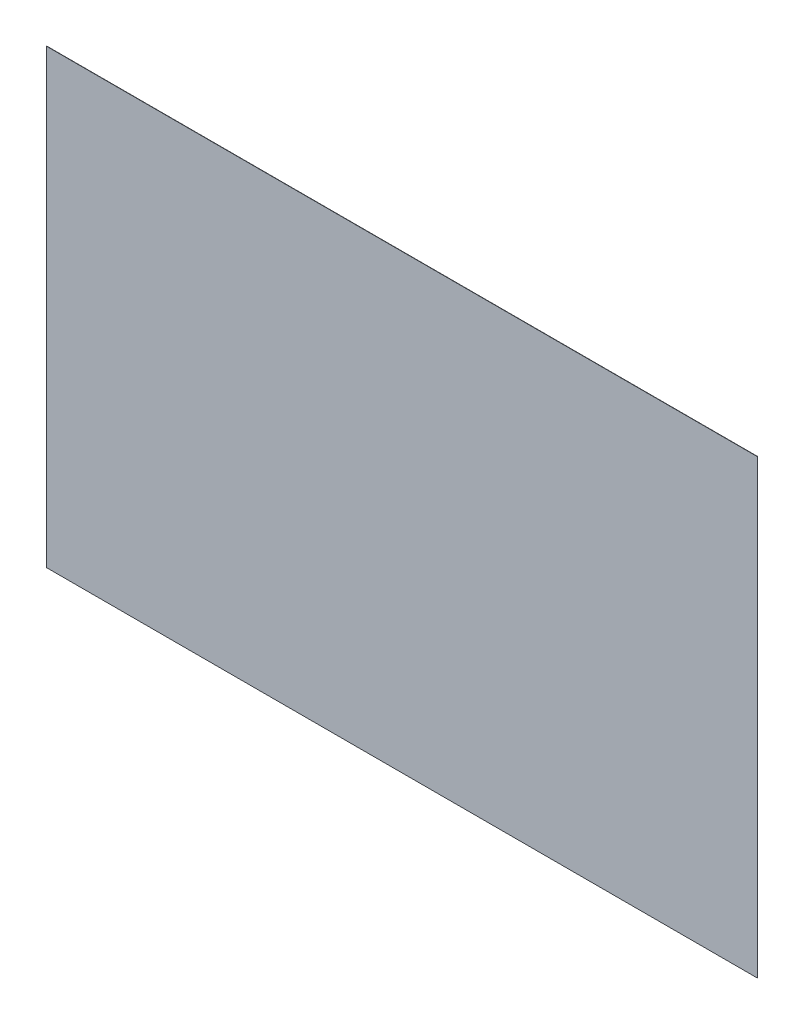
ISO-10303-21;
HEADER;
FILE_DESCRIPTION(('STEP AP214'),'2;1');
FILE_NAME('part.step','',(''),(''),'','','');
FILE_SCHEMA(('AUTOMOTIVE_DESIGN { 1 0 10303 214 1 1 1 1 }'));
ENDSEC;
DATA;
#1=APPLICATION_CONTEXT('core data for automotive mechanical design processes');
#2=APPLICATION_PROTOCOL_DEFINITION('international standard','automotive_design',2000,#1);
#3=PRODUCT_CONTEXT('',#1,'mechanical');
#4=PRODUCT('Part','Part','',(#3));
#5=PRODUCT_RELATED_PRODUCT_CATEGORY('part','',(#4));
#6=PRODUCT_DEFINITION_FORMATION('','',#4);
#7=PRODUCT_DEFINITION_CONTEXT('part definition',#1,'design');
#8=PRODUCT_DEFINITION('design','',#6,#7);
#9=PRODUCT_DEFINITION_SHAPE('','',#8);
#10=(LENGTH_UNIT() NAMED_UNIT(*) SI_UNIT(.MILLI.,.METRE.));
#11=(NAMED_UNIT(*) PLANE_ANGLE_UNIT() SI_UNIT($,.RADIAN.));
#12=(NAMED_UNIT(*) SI_UNIT($,.STERADIAN.) SOLID_ANGLE_UNIT());
#13=UNCERTAINTY_MEASURE_WITH_UNIT(LENGTH_MEASURE(1.E-05),#10,'distance_accuracy_value','');
#14=(GEOMETRIC_REPRESENTATION_CONTEXT(3) GLOBAL_UNCERTAINTY_ASSIGNED_CONTEXT((#13)) GLOBAL_UNIT_ASSIGNED_CONTEXT((#10,
#11,#12)) REPRESENTATION_CONTEXT('',''));
#15=CARTESIAN_POINT('',(0.,0.,0.));
#16=DIRECTION('',(0.,0.,1.));
#17=DIRECTION('',(1.,0.,0.));
#18=AXIS2_PLACEMENT_3D('',#15,#16,#17);
#19=CARTESIAN_POINT('',(0.,0.,1.));
#20=DIRECTION('',(1.,0.,0.));
#21=DIRECTION('',(0.,0.,-1.));
#22=AXIS2_PLACEMENT_3D('',#19,#20,#21);
#23=PLANE('',#22);
#24=DIRECTION('',(0.,-1.,0.));
#25=VECTOR('',#24,1.);
#26=CARTESIAN_POINT('',(0.,0.,0.));
#27=LINE('',#26,#25);
#28=CARTESIAN_POINT('',(0.,1550.,0.));
#29=VERTEX_POINT('',#28);
#30=CARTESIAN_POINT('',(0.,0.,0.));
#31=VERTEX_POINT('',#30);
#32=EDGE_CURVE('E107',#29,#31,#27,.T.);
#33=ORIENTED_EDGE('',*,*,#32,.T.);
#34=DIRECTION('',(0.,0.,-1.));
#35=VECTOR('',#34,1.);
#36=CARTESIAN_POINT('',(0.,0.,1.));
#37=LINE('',#36,#35);
#38=CARTESIAN_POINT('',(0.,0.,1.));
#39=VERTEX_POINT('',#38);
#40=EDGE_CURVE('E11',#39,#31,#37,.T.);
#41=ORIENTED_EDGE('',*,*,#40,.F.);
#42=DIRECTION('',(0.,-1.,0.));
#43=VECTOR('',#42,1.);
#44=CARTESIAN_POINT('',(0.,0.,1.));
#45=LINE('',#44,#43);
#46=CARTESIAN_POINT('',(0.,1550.,1.));
#47=VERTEX_POINT('',#46);
#48=EDGE_CURVE('E91',#47,#39,#45,.T.);
#49=ORIENTED_EDGE('',*,*,#48,.F.);
#50=DIRECTION('',(0.,0.,-1.));
#51=VECTOR('',#50,1.);
#52=CARTESIAN_POINT('',(0.,1550.,1.));
#53=LINE('',#52,#51);
#54=EDGE_CURVE('E103',#47,#29,#53,.T.);
#55=ORIENTED_EDGE('',*,*,#54,.T.);
#56=EDGE_LOOP('',(#33,#41,#49,#55));
#57=FACE_BOUND('',#56,.T.);
#58=ADVANCED_FACE('F39',(#57),#23,.F.);
#59=CARTESIAN_POINT('',(0.,0.,1.));
#60=DIRECTION('',(0.,1.,0.));
#61=DIRECTION('',(0.,0.,1.));
#62=AXIS2_PLACEMENT_3D('',#59,#60,#61);
#63=PLANE('',#62);
#64=DIRECTION('',(1.,0.,0.));
#65=VECTOR('',#64,1.);
#66=CARTESIAN_POINT('',(0.,0.,0.));
#67=LINE('',#66,#65);
#68=CARTESIAN_POINT('',(2440.,0.,0.));
#69=VERTEX_POINT('',#68);
#70=EDGE_CURVE('E96',#31,#69,#67,.T.);
#71=ORIENTED_EDGE('',*,*,#70,.T.);
#72=DIRECTION('',(0.,0.,-1.));
#73=VECTOR('',#72,1.);
#74=CARTESIAN_POINT('',(2440.,0.,1.));
#75=LINE('',#74,#73);
#76=CARTESIAN_POINT('',(2440.,0.,1.));
#77=VERTEX_POINT('',#76);
#78=EDGE_CURVE('E48',#77,#69,#75,.T.);
#79=ORIENTED_EDGE('',*,*,#78,.F.);
#80=DIRECTION('',(1.,0.,0.));
#81=VECTOR('',#80,1.);
#82=CARTESIAN_POINT('',(0.,0.,1.));
#83=LINE('',#82,#81);
#84=EDGE_CURVE('E86',#39,#77,#83,.T.);
#85=ORIENTED_EDGE('',*,*,#84,.F.);
#86=ORIENTED_EDGE('',*,*,#40,.T.);
#87=EDGE_LOOP('',(#71,#79,#85,#86));
#88=FACE_BOUND('',#87,.T.);
#89=ADVANCED_FACE('F95',(#88),#63,.F.);
#90=CARTESIAN_POINT('',(2440.,0.,1.));
#91=DIRECTION('',(-1.,0.,0.));
#92=DIRECTION('',(0.,0.,1.));
#93=AXIS2_PLACEMENT_3D('',#90,#91,#92);
#94=PLANE('',#93);
#95=DIRECTION('',(0.,1.,0.));
#96=VECTOR('',#95,1.);
#97=CARTESIAN_POINT('',(2440.,0.,0.));
#98=LINE('',#97,#96);
#99=CARTESIAN_POINT('',(2440.,1550.,0.));
#100=VERTEX_POINT('',#99);
#101=EDGE_CURVE('E73',#69,#100,#98,.T.);
#102=ORIENTED_EDGE('',*,*,#101,.T.);
#103=DIRECTION('',(0.,0.,-1.));
#104=VECTOR('',#103,1.);
#105=CARTESIAN_POINT('',(2440.,1550.,1.));
#106=LINE('',#105,#104);
#107=CARTESIAN_POINT('',(2440.,1550.,1.));
#108=VERTEX_POINT('',#107);
#109=EDGE_CURVE('E98',#108,#100,#106,.T.);
#110=ORIENTED_EDGE('',*,*,#109,.F.);
#111=DIRECTION('',(0.,1.,0.));
#112=VECTOR('',#111,1.);
#113=CARTESIAN_POINT('',(2440.,0.,1.));
#114=LINE('',#113,#112);
#115=EDGE_CURVE('E89',#77,#108,#114,.T.);
#116=ORIENTED_EDGE('',*,*,#115,.F.);
#117=ORIENTED_EDGE('',*,*,#78,.T.);
#118=EDGE_LOOP('',(#102,#110,#116,#117));
#119=FACE_BOUND('',#118,.T.);
#120=ADVANCED_FACE('F99',(#119),#94,.F.);
#121=CARTESIAN_POINT('',(0.,1550.,1.));
#122=DIRECTION('',(0.,-1.,0.));
#123=DIRECTION('',(0.,0.,-1.));
#124=AXIS2_PLACEMENT_3D('',#121,#122,#123);
#125=PLANE('',#124);
#126=DIRECTION('',(-1.,0.,0.));
#127=VECTOR('',#126,1.);
#128=CARTESIAN_POINT('',(0.,1550.,0.));
#129=LINE('',#128,#127);
#130=EDGE_CURVE('E79',#100,#29,#129,.T.);
#131=ORIENTED_EDGE('',*,*,#130,.T.);
#132=ORIENTED_EDGE('',*,*,#54,.F.);
#133=DIRECTION('',(-1.,0.,0.));
#134=VECTOR('',#133,1.);
#135=CARTESIAN_POINT('',(0.,1550.,1.));
#136=LINE('',#135,#134);
#137=EDGE_CURVE('E56',#108,#47,#136,.T.);
#138=ORIENTED_EDGE('',*,*,#137,.F.);
#139=ORIENTED_EDGE('',*,*,#109,.T.);
#140=EDGE_LOOP('',(#131,#132,#138,#139));
#141=FACE_BOUND('',#140,.T.);
#142=ADVANCED_FACE('F120',(#141),#125,.F.);
#143=CARTESIAN_POINT('',(0.,0.,1.));
#144=DIRECTION('',(0.,0.,-1.));
#145=DIRECTION('',(-1.,0.,0.));
#146=AXIS2_PLACEMENT_3D('',#143,#144,#145);
#147=PLANE('',#146);
#148=ORIENTED_EDGE('',*,*,#48,.T.);
#149=ORIENTED_EDGE('',*,*,#84,.T.);
#150=ORIENTED_EDGE('',*,*,#115,.T.);
#151=ORIENTED_EDGE('',*,*,#137,.T.);
#152=EDGE_LOOP('',(#148,#149,#150,#151));
#153=FACE_BOUND('',#152,.T.);
#154=ADVANCED_FACE('F87',(#153),#147,.F.);
#155=CARTESIAN_POINT('',(0.,0.,0.));
#156=DIRECTION('',(0.,0.,-1.));
#157=DIRECTION('',(-1.,0.,0.));
#158=AXIS2_PLACEMENT_3D('',#155,#156,#157);
#159=PLANE('',#158);
#160=ORIENTED_EDGE('',*,*,#32,.F.);
#161=ORIENTED_EDGE('',*,*,#130,.F.);
#162=ORIENTED_EDGE('',*,*,#101,.F.);
#163=ORIENTED_EDGE('',*,*,#70,.F.);
#164=EDGE_LOOP('',(#160,#161,#162,#163));
#165=FACE_BOUND('',#164,.T.);
#166=ADVANCED_FACE('F123',(#165),#159,.T.);
#167=CLOSED_SHELL('',(#58,#89,#120,#142,#154,#166));
#168=MANIFOLD_SOLID_BREP('B2',#167);
#169=ADVANCED_BREP_SHAPE_REPRESENTATION('',(#18,#168),#14);
#170=SHAPE_DEFINITION_REPRESENTATION(#9,#169);
ENDSEC;
END-ISO-10303-21;
